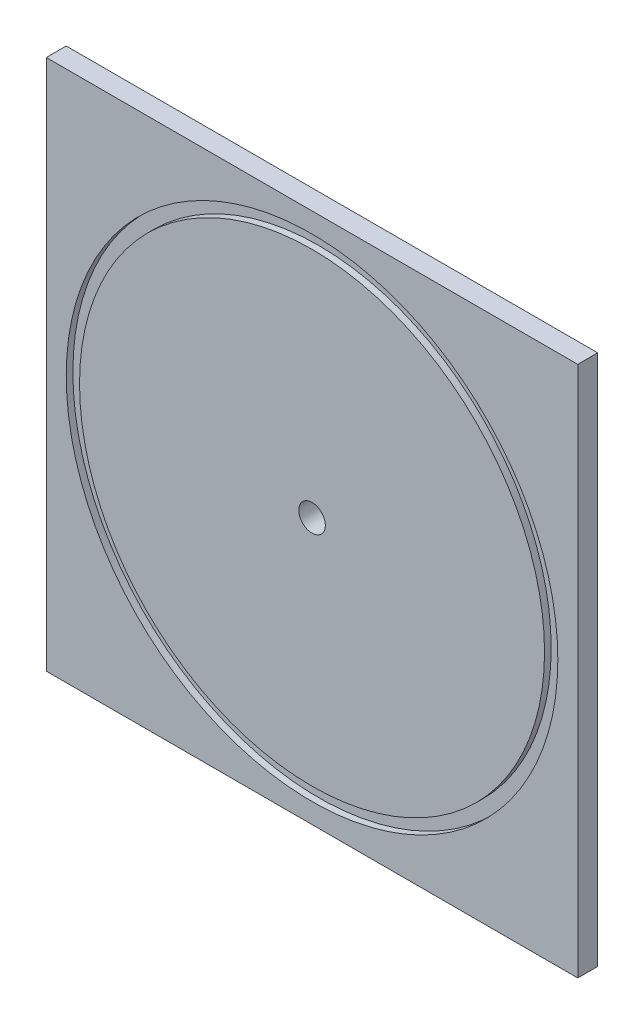
ISO-10303-21;
HEADER;
FILE_DESCRIPTION(('STEP AP214'),'2;1');
FILE_NAME('part.step','',(''),(''),'','','');
FILE_SCHEMA(('AUTOMOTIVE_DESIGN { 1 0 10303 214 1 1 1 1 }'));
ENDSEC;
DATA;
#1=APPLICATION_CONTEXT('core data for automotive mechanical design processes');
#2=APPLICATION_PROTOCOL_DEFINITION('international standard','automotive_design',2000,#1);
#3=PRODUCT_CONTEXT('',#1,'mechanical');
#4=PRODUCT('Part','Part','',(#3));
#5=PRODUCT_RELATED_PRODUCT_CATEGORY('part','',(#4));
#6=PRODUCT_DEFINITION_FORMATION('','',#4);
#7=PRODUCT_DEFINITION_CONTEXT('part definition',#1,'design');
#8=PRODUCT_DEFINITION('design','',#6,#7);
#9=PRODUCT_DEFINITION_SHAPE('','',#8);
#10=(LENGTH_UNIT() NAMED_UNIT(*) SI_UNIT(.MILLI.,.METRE.));
#11=(NAMED_UNIT(*) PLANE_ANGLE_UNIT() SI_UNIT($,.RADIAN.));
#12=(NAMED_UNIT(*) SI_UNIT($,.STERADIAN.) SOLID_ANGLE_UNIT());
#13=UNCERTAINTY_MEASURE_WITH_UNIT(LENGTH_MEASURE(1.E-05),#10,'distance_accuracy_value','');
#14=(GEOMETRIC_REPRESENTATION_CONTEXT(3) GLOBAL_UNCERTAINTY_ASSIGNED_CONTEXT((#13)) GLOBAL_UNIT_ASSIGNED_CONTEXT((#10,
#11,#12)) REPRESENTATION_CONTEXT('',''));
#15=CARTESIAN_POINT('',(0.,0.,0.));
#16=DIRECTION('',(0.,0.,1.));
#17=DIRECTION('',(1.,0.,0.));
#18=AXIS2_PLACEMENT_3D('',#15,#16,#17);
#19=CARTESIAN_POINT('',(0.,0.,3.81));
#20=DIRECTION('',(0.,0.,-1.));
#21=DIRECTION('',(-1.,0.,0.));
#22=AXIS2_PLACEMENT_3D('',#19,#20,#21);
#23=PLANE('',#22);
#24=CARTESIAN_POINT('',(0.,0.,3.81));
#25=DIRECTION('',(0.,0.,1.));
#26=DIRECTION('',(1.,0.,0.));
#27=AXIS2_PLACEMENT_3D('',#24,#25,#26);
#28=CIRCLE('',#27,2.54);
#29=CARTESIAN_POINT('',(2.54,0.,3.81));
#30=VERTEX_POINT('',#29);
#31=EDGE_CURVE('E118',#30,#30,#28,.T.);
#32=ORIENTED_EDGE('',*,*,#31,.F.);
#33=EDGE_LOOP('',(#32));
#34=FACE_BOUND('',#33,.T.);
#35=CARTESIAN_POINT('',(0.,0.,3.81));
#36=DIRECTION('',(0.,0.,1.));
#37=DIRECTION('',(1.,0.,0.));
#38=AXIS2_PLACEMENT_3D('',#35,#36,#37);
#39=CIRCLE('',#38,44.45);
#40=CARTESIAN_POINT('',(44.45,0.,3.81));
#41=VERTEX_POINT('',#40);
#42=EDGE_CURVE('E130',#41,#41,#39,.T.);
#43=ORIENTED_EDGE('',*,*,#42,.T.);
#44=EDGE_LOOP('',(#43));
#45=FACE_BOUND('',#44,.T.);
#46=ADVANCED_FACE('F40',(#34,#45),#23,.F.);
#47=CARTESIAN_POINT('',(50.8,-50.8,3.81));
#48=DIRECTION('',(-1.,0.,0.));
#49=DIRECTION('',(0.,0.,1.));
#50=AXIS2_PLACEMENT_3D('',#47,#48,#49);
#51=PLANE('',#50);
#52=DIRECTION('',(0.,1.,0.));
#53=VECTOR('',#52,1.);
#54=CARTESIAN_POINT('',(50.8,-50.8,0.));
#55=LINE('',#54,#53);
#56=CARTESIAN_POINT('',(50.8,-50.8,0.));
#57=VERTEX_POINT('',#56);
#58=CARTESIAN_POINT('',(50.8,50.8,0.));
#59=VERTEX_POINT('',#58);
#60=EDGE_CURVE('E104',#57,#59,#55,.T.);
#61=ORIENTED_EDGE('',*,*,#60,.T.);
#62=DIRECTION('',(0.,0.,-1.));
#63=VECTOR('',#62,1.);
#64=CARTESIAN_POINT('',(50.8,50.8,3.81));
#65=LINE('',#64,#63);
#66=CARTESIAN_POINT('',(50.8,50.8,3.81));
#67=VERTEX_POINT('',#66);
#68=EDGE_CURVE('E12',#67,#59,#65,.T.);
#69=ORIENTED_EDGE('',*,*,#68,.F.);
#70=DIRECTION('',(0.,1.,0.));
#71=VECTOR('',#70,1.);
#72=CARTESIAN_POINT('',(50.8,-50.8,3.81));
#73=LINE('',#72,#71);
#74=CARTESIAN_POINT('',(50.8,-50.8,3.81));
#75=VERTEX_POINT('',#74);
#76=EDGE_CURVE('E92',#75,#67,#73,.T.);
#77=ORIENTED_EDGE('',*,*,#76,.F.);
#78=DIRECTION('',(0.,0.,-1.));
#79=VECTOR('',#78,1.);
#80=CARTESIAN_POINT('',(50.8,-50.8,3.81));
#81=LINE('',#80,#79);
#82=EDGE_CURVE('E100',#75,#57,#81,.T.);
#83=ORIENTED_EDGE('',*,*,#82,.T.);
#84=EDGE_LOOP('',(#61,#69,#77,#83));
#85=FACE_BOUND('',#84,.T.);
#86=ADVANCED_FACE('F42',(#85),#51,.F.);
#87=CARTESIAN_POINT('',(-50.8,50.8,3.81));
#88=DIRECTION('',(0.,-1.,0.));
#89=DIRECTION('',(0.,0.,-1.));
#90=AXIS2_PLACEMENT_3D('',#87,#88,#89);
#91=PLANE('',#90);
#92=DIRECTION('',(-1.,0.,0.));
#93=VECTOR('',#92,1.);
#94=CARTESIAN_POINT('',(-50.8,50.8,0.));
#95=LINE('',#94,#93);
#96=CARTESIAN_POINT('',(-50.8,50.8,0.));
#97=VERTEX_POINT('',#96);
#98=EDGE_CURVE('E96',#59,#97,#95,.T.);
#99=ORIENTED_EDGE('',*,*,#98,.T.);
#100=DIRECTION('',(0.,0.,-1.));
#101=VECTOR('',#100,1.);
#102=CARTESIAN_POINT('',(-50.8,50.8,3.81));
#103=LINE('',#102,#101);
#104=CARTESIAN_POINT('',(-50.8,50.8,3.81));
#105=VERTEX_POINT('',#104);
#106=EDGE_CURVE('E49',#105,#97,#103,.T.);
#107=ORIENTED_EDGE('',*,*,#106,.F.);
#108=DIRECTION('',(-1.,0.,0.));
#109=VECTOR('',#108,1.);
#110=CARTESIAN_POINT('',(-50.8,50.8,3.81));
#111=LINE('',#110,#109);
#112=EDGE_CURVE('E87',#67,#105,#111,.T.);
#113=ORIENTED_EDGE('',*,*,#112,.F.);
#114=ORIENTED_EDGE('',*,*,#68,.T.);
#115=EDGE_LOOP('',(#99,#107,#113,#114));
#116=FACE_BOUND('',#115,.T.);
#117=ADVANCED_FACE('F95',(#116),#91,.F.);
#118=CARTESIAN_POINT('',(-50.8,-50.8,3.81));
#119=DIRECTION('',(1.,0.,0.));
#120=DIRECTION('',(0.,0.,-1.));
#121=AXIS2_PLACEMENT_3D('',#118,#119,#120);
#122=PLANE('',#121);
#123=DIRECTION('',(0.,-1.,0.));
#124=VECTOR('',#123,1.);
#125=CARTESIAN_POINT('',(-50.8,-50.8,0.));
#126=LINE('',#125,#124);
#127=CARTESIAN_POINT('',(-50.8,-50.8,0.));
#128=VERTEX_POINT('',#127);
#129=EDGE_CURVE('E74',#97,#128,#126,.T.);
#130=ORIENTED_EDGE('',*,*,#129,.T.);
#131=DIRECTION('',(0.,0.,-1.));
#132=VECTOR('',#131,1.);
#133=CARTESIAN_POINT('',(-50.8,-50.8,3.81));
#134=LINE('',#133,#132);
#135=CARTESIAN_POINT('',(-50.8,-50.8,3.81));
#136=VERTEX_POINT('',#135);
#137=EDGE_CURVE('E97',#136,#128,#134,.T.);
#138=ORIENTED_EDGE('',*,*,#137,.F.);
#139=DIRECTION('',(0.,-1.,0.));
#140=VECTOR('',#139,1.);
#141=CARTESIAN_POINT('',(-50.8,-50.8,3.81));
#142=LINE('',#141,#140);
#143=EDGE_CURVE('E90',#105,#136,#142,.T.);
#144=ORIENTED_EDGE('',*,*,#143,.F.);
#145=ORIENTED_EDGE('',*,*,#106,.T.);
#146=EDGE_LOOP('',(#130,#138,#144,#145));
#147=FACE_BOUND('',#146,.T.);
#148=ADVANCED_FACE('F98',(#147),#122,.F.);
#149=CARTESIAN_POINT('',(-50.8,-50.8,3.81));
#150=DIRECTION('',(0.,1.,0.));
#151=DIRECTION('',(0.,0.,1.));
#152=AXIS2_PLACEMENT_3D('',#149,#150,#151);
#153=PLANE('',#152);
#154=DIRECTION('',(1.,0.,0.));
#155=VECTOR('',#154,1.);
#156=CARTESIAN_POINT('',(-50.8,-50.8,0.));
#157=LINE('',#156,#155);
#158=EDGE_CURVE('E80',#128,#57,#157,.T.);
#159=ORIENTED_EDGE('',*,*,#158,.T.);
#160=ORIENTED_EDGE('',*,*,#82,.F.);
#161=DIRECTION('',(1.,0.,0.));
#162=VECTOR('',#161,1.);
#163=CARTESIAN_POINT('',(-50.8,-50.8,3.81));
#164=LINE('',#163,#162);
#165=EDGE_CURVE('E57',#136,#75,#164,.T.);
#166=ORIENTED_EDGE('',*,*,#165,.F.);
#167=ORIENTED_EDGE('',*,*,#137,.T.);
#168=EDGE_LOOP('',(#159,#160,#166,#167));
#169=FACE_BOUND('',#168,.T.);
#170=ADVANCED_FACE('F112',(#169),#153,.F.);
#171=CARTESIAN_POINT('',(0.,0.,3.81));
#172=DIRECTION('',(0.,0.,1.));
#173=DIRECTION('',(1.,0.,0.));
#174=AXIS2_PLACEMENT_3D('',#171,#172,#173);
#175=CIRCLE('',#174,46.99);
#176=CARTESIAN_POINT('',(46.99,0.,3.81));
#177=VERTEX_POINT('',#176);
#178=EDGE_CURVE('E124',#177,#177,#175,.T.);
#179=ORIENTED_EDGE('',*,*,#178,.F.);
#180=EDGE_LOOP('',(#179));
#181=FACE_BOUND('',#180,.T.);
#182=ORIENTED_EDGE('',*,*,#76,.T.);
#183=ORIENTED_EDGE('',*,*,#112,.T.);
#184=ORIENTED_EDGE('',*,*,#143,.T.);
#185=ORIENTED_EDGE('',*,*,#165,.T.);
#186=EDGE_LOOP('',(#182,#183,#184,#185));
#187=FACE_BOUND('',#186,.T.);
#188=ADVANCED_FACE('F88',(#181,#187),#23,.F.);
#189=CARTESIAN_POINT('',(0.,0.,0.));
#190=DIRECTION('',(0.,0.,-1.));
#191=DIRECTION('',(-1.,0.,0.));
#192=AXIS2_PLACEMENT_3D('',#189,#190,#191);
#193=PLANE('',#192);
#194=CARTESIAN_POINT('',(0.,0.,0.));
#195=DIRECTION('',(0.,0.,1.));
#196=DIRECTION('',(1.,0.,0.));
#197=AXIS2_PLACEMENT_3D('',#194,#195,#196);
#198=CIRCLE('',#197,2.54);
#199=CARTESIAN_POINT('',(2.54,0.,0.));
#200=VERTEX_POINT('',#199);
#201=EDGE_CURVE('E107',#200,#200,#198,.T.);
#202=ORIENTED_EDGE('',*,*,#201,.T.);
#203=EDGE_LOOP('',(#202));
#204=FACE_BOUND('',#203,.T.);
#205=ORIENTED_EDGE('',*,*,#60,.F.);
#206=ORIENTED_EDGE('',*,*,#158,.F.);
#207=ORIENTED_EDGE('',*,*,#129,.F.);
#208=ORIENTED_EDGE('',*,*,#98,.F.);
#209=EDGE_LOOP('',(#205,#206,#207,#208));
#210=FACE_BOUND('',#209,.T.);
#211=ADVANCED_FACE('F115',(#204,#210),#193,.T.);
#212=CARTESIAN_POINT('',(0.,0.,0.));
#213=DIRECTION('',(0.,0.,1.));
#214=DIRECTION('',(1.,0.,0.));
#215=AXIS2_PLACEMENT_3D('',#212,#213,#214);
#216=CYLINDRICAL_SURFACE('',#215,2.54);
#217=CARTESIAN_POINT('',(2.54,0.,0.));
#218=CARTESIAN_POINT('',(2.54,0.,0.0396874999999999));
#219=CARTESIAN_POINT('',(2.54,0.,0.079375));
#220=CARTESIAN_POINT('',(2.54,0.,0.15875));
#221=CARTESIAN_POINT('',(2.54,0.,0.1984375));
#222=CARTESIAN_POINT('',(2.54,0.,0.2778125));
#223=CARTESIAN_POINT('',(2.54,0.,0.3175));
#224=CARTESIAN_POINT('',(2.54,0.,0.396875));
#225=CARTESIAN_POINT('',(2.54,0.,0.4365625));
#226=CARTESIAN_POINT('',(2.54,0.,0.5159375));
#227=CARTESIAN_POINT('',(2.54,0.,0.555625));
#228=CARTESIAN_POINT('',(2.54,0.,0.635));
#229=CARTESIAN_POINT('',(2.54,0.,0.6746875));
#230=CARTESIAN_POINT('',(2.54,0.,0.7540625));
#231=CARTESIAN_POINT('',(2.54,0.,0.79375));
#232=CARTESIAN_POINT('',(2.54,0.,0.873125));
#233=CARTESIAN_POINT('',(2.54,0.,0.9128125));
#234=CARTESIAN_POINT('',(2.54,0.,0.9921875));
#235=CARTESIAN_POINT('',(2.54,0.,1.031875));
#236=CARTESIAN_POINT('',(2.54,0.,1.11125));
#237=CARTESIAN_POINT('',(2.54,0.,1.1509375));
#238=CARTESIAN_POINT('',(2.54,0.,1.2303125));
#239=CARTESIAN_POINT('',(2.54,0.,1.27));
#240=CARTESIAN_POINT('',(2.54,0.,1.349375));
#241=CARTESIAN_POINT('',(2.54,0.,1.3890625));
#242=CARTESIAN_POINT('',(2.54,0.,1.4684375));
#243=CARTESIAN_POINT('',(2.54,0.,1.508125));
#244=CARTESIAN_POINT('',(2.54,0.,1.5875));
#245=CARTESIAN_POINT('',(2.54,0.,1.6271875));
#246=CARTESIAN_POINT('',(2.54,0.,1.7065625));
#247=CARTESIAN_POINT('',(2.54,0.,1.74625));
#248=CARTESIAN_POINT('',(2.54,0.,1.825625));
#249=CARTESIAN_POINT('',(2.54,0.,1.8653125));
#250=CARTESIAN_POINT('',(2.54,0.,1.9446875));
#251=CARTESIAN_POINT('',(2.54,0.,1.984375));
#252=CARTESIAN_POINT('',(2.54,0.,2.06375));
#253=CARTESIAN_POINT('',(2.54,0.,2.1034375));
#254=CARTESIAN_POINT('',(2.54,0.,2.1828125));
#255=CARTESIAN_POINT('',(2.54,0.,2.2225));
#256=CARTESIAN_POINT('',(2.54,0.,2.301875));
#257=CARTESIAN_POINT('',(2.54,0.,2.3415625));
#258=CARTESIAN_POINT('',(2.54,0.,2.4209375));
#259=CARTESIAN_POINT('',(2.54,0.,2.460625));
#260=CARTESIAN_POINT('',(2.54,0.,2.54));
#261=CARTESIAN_POINT('',(2.54,0.,2.5796875));
#262=CARTESIAN_POINT('',(2.54,0.,2.6590625));
#263=CARTESIAN_POINT('',(2.54,0.,2.69875));
#264=CARTESIAN_POINT('',(2.54,0.,2.778125));
#265=CARTESIAN_POINT('',(2.54,0.,2.8178125));
#266=CARTESIAN_POINT('',(2.54,0.,2.8971875));
#267=CARTESIAN_POINT('',(2.54,0.,2.936875));
#268=CARTESIAN_POINT('',(2.54,0.,3.01625));
#269=CARTESIAN_POINT('',(2.54,0.,3.0559375));
#270=CARTESIAN_POINT('',(2.54,0.,3.1353125));
#271=CARTESIAN_POINT('',(2.54,0.,3.175));
#272=CARTESIAN_POINT('',(2.54,0.,3.254375));
#273=CARTESIAN_POINT('',(2.54,0.,3.2940625));
#274=CARTESIAN_POINT('',(2.54,0.,3.3734375));
#275=CARTESIAN_POINT('',(2.54,0.,3.413125));
#276=CARTESIAN_POINT('',(2.54,0.,3.4925));
#277=CARTESIAN_POINT('',(2.54,0.,3.5321875));
#278=CARTESIAN_POINT('',(2.54,0.,3.6115625));
#279=CARTESIAN_POINT('',(2.54,0.,3.65125));
#280=CARTESIAN_POINT('',(2.54,0.,3.730625));
#281=CARTESIAN_POINT('',(2.54,0.,3.7703125));
#282=CARTESIAN_POINT('',(2.54,0.,3.81));
#283=B_SPLINE_CURVE_WITH_KNOTS('',3,(#217,#218,#219,#220,#221,#222,#223,#224,#225,#226,#227,
#228,#229,#230,#231,#232,#233,#234,#235,#236,#237,#238,#239,#240,#241,#242,#243,#244,#245,#246,
#247,#248,#249,#250,#251,#252,#253,#254,#255,#256,#257,#258,#259,#260,#261,#262,#263,#264,#265,
#266,#267,#268,#269,#270,#271,#272,#273,#274,#275,#276,#277,#278,#279,#280,#281,#282),
.UNSPECIFIED.,.F.,.F.,(4,2,2,2,2,2,2,2,2,2,2,2,2,2,2,2,2,2,2,2,2,2,2,2,2,2,2,2,2,2,2,2,4),(0.,
0.1190625,0.238125,0.3571875,0.47625,0.5953125,0.714375,0.8334375,0.9525,1.0715625,1.190625,
1.3096875,1.42875,1.5478125,1.666875,1.7859375,1.905,2.0240625,2.143125,2.2621875,2.38125,
2.5003125,2.619375,2.7384375,2.8575,2.9765625,3.095625,3.2146875,3.33375,3.4528125,3.571875,
3.6909375,3.81),.UNSPECIFIED.);
#284=EDGE_CURVE('BSEAM148',#200,#30,#283,.T.);
#285=ORIENTED_EDGE('',*,*,#201,.F.);
#286=ORIENTED_EDGE('',*,*,#31,.T.);
#287=ORIENTED_EDGE('',*,*,#284,.T.);
#288=ORIENTED_EDGE('',*,*,#284,.F.);
#289=EDGE_LOOP('',(#285,#287,#286,#288));
#290=FACE_BOUND('',#289,.T.);
#291=ADVANCED_FACE('F148',(#290),#216,.F.);
#292=CARTESIAN_POINT('',(0.,0.,2.54));
#293=DIRECTION('',(0.,0.,1.));
#294=DIRECTION('',(1.,0.,0.));
#295=AXIS2_PLACEMENT_3D('',#292,#293,#294);
#296=CYLINDRICAL_SURFACE('',#295,46.99);
#297=CARTESIAN_POINT('',(0.,0.,2.54));
#298=DIRECTION('',(0.,0.,1.));
#299=DIRECTION('',(1.,0.,0.));
#300=AXIS2_PLACEMENT_3D('',#297,#298,#299);
#301=CIRCLE('',#300,46.99);
#302=CARTESIAN_POINT('',(46.99,0.,2.54));
#303=VERTEX_POINT('',#302);
#304=EDGE_CURVE('E121',#303,#303,#301,.T.);
#305=ORIENTED_EDGE('',*,*,#304,.F.);
#306=EDGE_LOOP('',(#305));
#307=FACE_BOUND('',#306,.T.);
#308=ORIENTED_EDGE('',*,*,#178,.T.);
#309=EDGE_LOOP('',(#308));
#310=FACE_BOUND('',#309,.T.);
#311=ADVANCED_FACE('F142',(#307,#310),#296,.F.);
#312=CARTESIAN_POINT('',(0.,0.,2.54));
#313=DIRECTION('',(0.,0.,1.));
#314=DIRECTION('',(1.,0.,0.));
#315=AXIS2_PLACEMENT_3D('',#312,#313,#314);
#316=PLANE('',#315);
#317=CARTESIAN_POINT('',(0.,0.,2.54));
#318=DIRECTION('',(0.,0.,1.));
#319=DIRECTION('',(1.,0.,0.));
#320=AXIS2_PLACEMENT_3D('',#317,#318,#319);
#321=CIRCLE('',#320,44.45);
#322=CARTESIAN_POINT('',(44.45,0.,2.54));
#323=VERTEX_POINT('',#322);
#324=EDGE_CURVE('E127',#323,#323,#321,.T.);
#325=ORIENTED_EDGE('',*,*,#324,.F.);
#326=EDGE_LOOP('',(#325));
#327=FACE_BOUND('',#326,.T.);
#328=ORIENTED_EDGE('',*,*,#304,.T.);
#329=EDGE_LOOP('',(#328));
#330=FACE_BOUND('',#329,.T.);
#331=ADVANCED_FACE('F139',(#327,#330),#316,.T.);
#332=CARTESIAN_POINT('',(0.,0.,2.54));
#333=DIRECTION('',(0.,0.,1.));
#334=DIRECTION('',(1.,0.,0.));
#335=AXIS2_PLACEMENT_3D('',#332,#333,#334);
#336=CYLINDRICAL_SURFACE('',#335,44.45);
#337=ORIENTED_EDGE('',*,*,#324,.T.);
#338=EDGE_LOOP('',(#337));
#339=FACE_BOUND('',#338,.T.);
#340=ORIENTED_EDGE('',*,*,#42,.F.);
#341=EDGE_LOOP('',(#340));
#342=FACE_BOUND('',#341,.T.);
#343=ADVANCED_FACE('F136',(#339,#342),#336,.T.);
#344=CLOSED_SHELL('',(#46,#86,#117,#148,#170,#188,#211,#291,#311,#331,#343));
#345=MANIFOLD_SOLID_BREP('B2',#344);
#346=ADVANCED_BREP_SHAPE_REPRESENTATION('',(#18,#345),#14);
#347=SHAPE_DEFINITION_REPRESENTATION(#9,#346);
ENDSEC;
END-ISO-10303-21;
